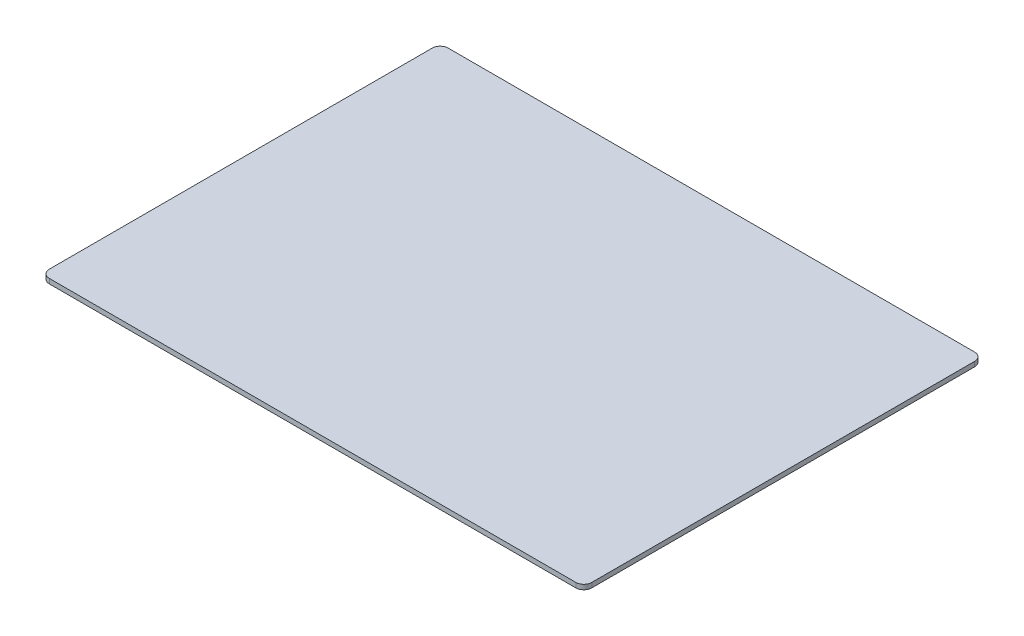
ISO-10303-21;
HEADER;
FILE_DESCRIPTION(('STEP AP214'),'2;1');
FILE_NAME('part.step','',(''),(''),'','','');
FILE_SCHEMA(('AUTOMOTIVE_DESIGN { 1 0 10303 214 1 1 1 1 }'));
ENDSEC;
DATA;
#1=APPLICATION_CONTEXT('core data for automotive mechanical design processes');
#2=APPLICATION_PROTOCOL_DEFINITION('international standard','automotive_design',2000,#1);
#3=PRODUCT_CONTEXT('',#1,'mechanical');
#4=PRODUCT('Part','Part','',(#3));
#5=PRODUCT_RELATED_PRODUCT_CATEGORY('part','',(#4));
#6=PRODUCT_DEFINITION_FORMATION('','',#4);
#7=PRODUCT_DEFINITION_CONTEXT('part definition',#1,'design');
#8=PRODUCT_DEFINITION('design','',#6,#7);
#9=PRODUCT_DEFINITION_SHAPE('','',#8);
#10=(LENGTH_UNIT() NAMED_UNIT(*) SI_UNIT(.MILLI.,.METRE.));
#11=(NAMED_UNIT(*) PLANE_ANGLE_UNIT() SI_UNIT($,.RADIAN.));
#12=(NAMED_UNIT(*) SI_UNIT($,.STERADIAN.) SOLID_ANGLE_UNIT());
#13=UNCERTAINTY_MEASURE_WITH_UNIT(LENGTH_MEASURE(1.E-05),#10,'distance_accuracy_value','');
#14=(GEOMETRIC_REPRESENTATION_CONTEXT(3) GLOBAL_UNCERTAINTY_ASSIGNED_CONTEXT((#13)) GLOBAL_UNIT_ASSIGNED_CONTEXT((#10,
#11,#12)) REPRESENTATION_CONTEXT('',''));
#15=CARTESIAN_POINT('',(0.,0.,0.));
#16=DIRECTION('',(0.,0.,1.));
#17=DIRECTION('',(1.,0.,0.));
#18=AXIS2_PLACEMENT_3D('',#15,#16,#17);
#19=CARTESIAN_POINT('',(-165.,3.,120.));
#20=DIRECTION('',(0.,-1.,0.));
#21=DIRECTION('',(0.,0.,-1.));
#22=AXIS2_PLACEMENT_3D('',#19,#20,#21);
#23=CYLINDRICAL_SURFACE('',#22,5.);
#24=CARTESIAN_POINT('',(-165.,0.,120.));
#25=DIRECTION('',(0.,1.,0.));
#26=DIRECTION('',(0.,0.,-1.));
#27=AXIS2_PLACEMENT_3D('',#24,#25,#26);
#28=CIRCLE('',#27,5.);
#29=CARTESIAN_POINT('',(-170.,0.,120.));
#30=VERTEX_POINT('',#29);
#31=CARTESIAN_POINT('',(-165.,0.,125.));
#32=VERTEX_POINT('',#31);
#33=EDGE_CURVE('E140',#30,#32,#28,.T.);
#34=ORIENTED_EDGE('',*,*,#33,.T.);
#35=DIRECTION('',(0.,-1.,0.));
#36=VECTOR('',#35,1.);
#37=CARTESIAN_POINT('',(-165.,3.,125.));
#38=LINE('',#37,#36);
#39=CARTESIAN_POINT('',(-165.,3.,125.));
#40=VERTEX_POINT('',#39);
#41=EDGE_CURVE('E11',#40,#32,#38,.T.);
#42=ORIENTED_EDGE('',*,*,#41,.F.);
#43=CARTESIAN_POINT('',(-165.,3.,120.));
#44=DIRECTION('',(0.,1.,0.));
#45=DIRECTION('',(0.,0.,-1.));
#46=AXIS2_PLACEMENT_3D('',#43,#44,#45);
#47=CIRCLE('',#46,5.);
#48=CARTESIAN_POINT('',(-170.,3.,120.));
#49=VERTEX_POINT('',#48);
#50=EDGE_CURVE('E162',#49,#40,#47,.T.);
#51=ORIENTED_EDGE('',*,*,#50,.F.);
#52=DIRECTION('',(0.,-1.,0.));
#53=VECTOR('',#52,1.);
#54=CARTESIAN_POINT('',(-170.,3.,120.));
#55=LINE('',#54,#53);
#56=EDGE_CURVE('E136',#49,#30,#55,.T.);
#57=ORIENTED_EDGE('',*,*,#56,.T.);
#58=EDGE_LOOP('',(#34,#42,#51,#57));
#59=FACE_BOUND('',#58,.T.);
#60=ADVANCED_FACE('F39',(#59),#23,.T.);
#61=CARTESIAN_POINT('',(-165.,3.,125.));
#62=DIRECTION('',(0.,0.,-1.));
#63=DIRECTION('',(-1.,0.,0.));
#64=AXIS2_PLACEMENT_3D('',#61,#62,#63);
#65=PLANE('',#64);
#66=DIRECTION('',(1.,0.,0.));
#67=VECTOR('',#66,1.);
#68=CARTESIAN_POINT('',(-165.,0.,125.));
#69=LINE('',#68,#67);
#70=CARTESIAN_POINT('',(165.,0.,125.));
#71=VERTEX_POINT('',#70);
#72=EDGE_CURVE('E144',#32,#71,#69,.T.);
#73=ORIENTED_EDGE('',*,*,#72,.T.);
#74=DIRECTION('',(0.,-1.,0.));
#75=VECTOR('',#74,1.);
#76=CARTESIAN_POINT('',(165.,3.,125.));
#77=LINE('',#76,#75);
#78=CARTESIAN_POINT('',(165.,3.,125.));
#79=VERTEX_POINT('',#78);
#80=EDGE_CURVE('E48',#79,#71,#77,.T.);
#81=ORIENTED_EDGE('',*,*,#80,.F.);
#82=DIRECTION('',(1.,0.,0.));
#83=VECTOR('',#82,1.);
#84=CARTESIAN_POINT('',(-165.,3.,125.));
#85=LINE('',#84,#83);
#86=EDGE_CURVE('E99',#40,#79,#85,.T.);
#87=ORIENTED_EDGE('',*,*,#86,.F.);
#88=ORIENTED_EDGE('',*,*,#41,.T.);
#89=EDGE_LOOP('',(#73,#81,#87,#88));
#90=FACE_BOUND('',#89,.T.);
#91=ADVANCED_FACE('F208',(#90),#65,.F.);
#92=CARTESIAN_POINT('',(165.,3.,120.));
#93=DIRECTION('',(0.,-1.,0.));
#94=DIRECTION('',(0.,0.,-1.));
#95=AXIS2_PLACEMENT_3D('',#92,#93,#94);
#96=CYLINDRICAL_SURFACE('',#95,5.);
#97=CARTESIAN_POINT('',(165.,0.,120.));
#98=DIRECTION('',(0.,1.,0.));
#99=DIRECTION('',(0.,0.,-1.));
#100=AXIS2_PLACEMENT_3D('',#97,#98,#99);
#101=CIRCLE('',#100,5.);
#102=CARTESIAN_POINT('',(170.,0.,120.));
#103=VERTEX_POINT('',#102);
#104=EDGE_CURVE('E147',#71,#103,#101,.T.);
#105=ORIENTED_EDGE('',*,*,#104,.T.);
#106=DIRECTION('',(0.,-1.,0.));
#107=VECTOR('',#106,1.);
#108=CARTESIAN_POINT('',(170.,3.,120.));
#109=LINE('',#108,#107);
#110=CARTESIAN_POINT('',(170.,3.,120.));
#111=VERTEX_POINT('',#110);
#112=EDGE_CURVE('E173',#111,#103,#109,.T.);
#113=ORIENTED_EDGE('',*,*,#112,.F.);
#114=CARTESIAN_POINT('',(165.,3.,120.));
#115=DIRECTION('',(0.,1.,0.));
#116=DIRECTION('',(0.,0.,-1.));
#117=AXIS2_PLACEMENT_3D('',#114,#115,#116);
#118=CIRCLE('',#117,5.);
#119=EDGE_CURVE('E183',#79,#111,#118,.T.);
#120=ORIENTED_EDGE('',*,*,#119,.F.);
#121=ORIENTED_EDGE('',*,*,#80,.T.);
#122=EDGE_LOOP('',(#105,#113,#120,#121));
#123=FACE_BOUND('',#122,.T.);
#124=ADVANCED_FACE('F181',(#123),#96,.T.);
#125=CARTESIAN_POINT('',(170.,3.,-120.));
#126=DIRECTION('',(-1.,0.,0.));
#127=DIRECTION('',(0.,0.,1.));
#128=AXIS2_PLACEMENT_3D('',#125,#126,#127);
#129=PLANE('',#128);
#130=DIRECTION('',(0.,0.,-1.));
#131=VECTOR('',#130,1.);
#132=CARTESIAN_POINT('',(170.,0.,-120.));
#133=LINE('',#132,#131);
#134=CARTESIAN_POINT('',(170.,0.,-120.));
#135=VERTEX_POINT('',#134);
#136=EDGE_CURVE('E150',#103,#135,#133,.T.);
#137=ORIENTED_EDGE('',*,*,#136,.T.);
#138=DIRECTION('',(0.,-1.,0.));
#139=VECTOR('',#138,1.);
#140=CARTESIAN_POINT('',(170.,3.,-120.));
#141=LINE('',#140,#139);
#142=CARTESIAN_POINT('',(170.,3.,-120.));
#143=VERTEX_POINT('',#142);
#144=EDGE_CURVE('E169',#143,#135,#141,.T.);
#145=ORIENTED_EDGE('',*,*,#144,.F.);
#146=DIRECTION('',(0.,0.,-1.));
#147=VECTOR('',#146,1.);
#148=CARTESIAN_POINT('',(170.,3.,-120.));
#149=LINE('',#148,#147);
#150=EDGE_CURVE('E196',#111,#143,#149,.T.);
#151=ORIENTED_EDGE('',*,*,#150,.F.);
#152=ORIENTED_EDGE('',*,*,#112,.T.);
#153=EDGE_LOOP('',(#137,#145,#151,#152));
#154=FACE_BOUND('',#153,.T.);
#155=ADVANCED_FACE('F191',(#154),#129,.F.);
#156=CARTESIAN_POINT('',(165.,3.,-120.));
#157=DIRECTION('',(0.,-1.,0.));
#158=DIRECTION('',(0.,0.,-1.));
#159=AXIS2_PLACEMENT_3D('',#156,#157,#158);
#160=CYLINDRICAL_SURFACE('',#159,5.);
#161=CARTESIAN_POINT('',(165.,0.,-120.));
#162=DIRECTION('',(0.,1.,0.));
#163=DIRECTION('',(0.,0.,1.));
#164=AXIS2_PLACEMENT_3D('',#161,#162,#163);
#165=CIRCLE('',#164,5.);
#166=CARTESIAN_POINT('',(165.,0.,-125.));
#167=VERTEX_POINT('',#166);
#168=EDGE_CURVE('E153',#135,#167,#165,.T.);
#169=ORIENTED_EDGE('',*,*,#168,.T.);
#170=DIRECTION('',(0.,-1.,0.));
#171=VECTOR('',#170,1.);
#172=CARTESIAN_POINT('',(165.,3.,-125.));
#173=LINE('',#172,#171);
#174=CARTESIAN_POINT('',(165.,3.,-125.));
#175=VERTEX_POINT('',#174);
#176=EDGE_CURVE('E129',#175,#167,#173,.T.);
#177=ORIENTED_EDGE('',*,*,#176,.F.);
#178=CARTESIAN_POINT('',(165.,3.,-120.));
#179=DIRECTION('',(0.,1.,0.));
#180=DIRECTION('',(0.,0.,1.));
#181=AXIS2_PLACEMENT_3D('',#178,#179,#180);
#182=CIRCLE('',#181,5.);
#183=EDGE_CURVE('E118',#143,#175,#182,.T.);
#184=ORIENTED_EDGE('',*,*,#183,.F.);
#185=ORIENTED_EDGE('',*,*,#144,.T.);
#186=EDGE_LOOP('',(#169,#177,#184,#185));
#187=FACE_BOUND('',#186,.T.);
#188=ADVANCED_FACE('F194',(#187),#160,.T.);
#189=CARTESIAN_POINT('',(-165.,3.,-125.));
#190=DIRECTION('',(0.,0.,1.));
#191=DIRECTION('',(1.,0.,0.));
#192=AXIS2_PLACEMENT_3D('',#189,#190,#191);
#193=PLANE('',#192);
#194=DIRECTION('',(-1.,0.,0.));
#195=VECTOR('',#194,1.);
#196=CARTESIAN_POINT('',(-165.,0.,-125.));
#197=LINE('',#196,#195);
#198=CARTESIAN_POINT('',(-165.,0.,-125.));
#199=VERTEX_POINT('',#198);
#200=EDGE_CURVE('E127',#167,#199,#197,.T.);
#201=ORIENTED_EDGE('',*,*,#200,.T.);
#202=DIRECTION('',(0.,-1.,0.));
#203=VECTOR('',#202,1.);
#204=CARTESIAN_POINT('',(-165.,3.,-125.));
#205=LINE('',#204,#203);
#206=CARTESIAN_POINT('',(-165.,3.,-125.));
#207=VERTEX_POINT('',#206);
#208=EDGE_CURVE('E124',#207,#199,#205,.T.);
#209=ORIENTED_EDGE('',*,*,#208,.F.);
#210=DIRECTION('',(-1.,0.,0.));
#211=VECTOR('',#210,1.);
#212=CARTESIAN_POINT('',(-165.,3.,-125.));
#213=LINE('',#212,#211);
#214=EDGE_CURVE('E112',#175,#207,#213,.T.);
#215=ORIENTED_EDGE('',*,*,#214,.F.);
#216=ORIENTED_EDGE('',*,*,#176,.T.);
#217=EDGE_LOOP('',(#201,#209,#215,#216));
#218=FACE_BOUND('',#217,.T.);
#219=ADVANCED_FACE('F125',(#218),#193,.F.);
#220=CARTESIAN_POINT('',(-165.,3.,-120.));
#221=DIRECTION('',(0.,-1.,0.));
#222=DIRECTION('',(0.,0.,-1.));
#223=AXIS2_PLACEMENT_3D('',#220,#221,#222);
#224=CYLINDRICAL_SURFACE('',#223,5.);
#225=CARTESIAN_POINT('',(-165.,0.,-120.));
#226=DIRECTION('',(0.,1.,0.));
#227=DIRECTION('',(0.,0.,1.));
#228=AXIS2_PLACEMENT_3D('',#225,#226,#227);
#229=CIRCLE('',#228,5.);
#230=CARTESIAN_POINT('',(-170.,0.,-120.));
#231=VERTEX_POINT('',#230);
#232=EDGE_CURVE('E85',#199,#231,#229,.T.);
#233=ORIENTED_EDGE('',*,*,#232,.T.);
#234=DIRECTION('',(0.,-1.,0.));
#235=VECTOR('',#234,1.);
#236=CARTESIAN_POINT('',(-170.,3.,-120.));
#237=LINE('',#236,#235);
#238=CARTESIAN_POINT('',(-170.,3.,-120.));
#239=VERTEX_POINT('',#238);
#240=EDGE_CURVE('E130',#239,#231,#237,.T.);
#241=ORIENTED_EDGE('',*,*,#240,.F.);
#242=CARTESIAN_POINT('',(-165.,3.,-120.));
#243=DIRECTION('',(0.,1.,0.));
#244=DIRECTION('',(0.,0.,1.));
#245=AXIS2_PLACEMENT_3D('',#242,#243,#244);
#246=CIRCLE('',#245,5.);
#247=EDGE_CURVE('E116',#207,#239,#246,.T.);
#248=ORIENTED_EDGE('',*,*,#247,.F.);
#249=ORIENTED_EDGE('',*,*,#208,.T.);
#250=EDGE_LOOP('',(#233,#241,#248,#249));
#251=FACE_BOUND('',#250,.T.);
#252=ADVANCED_FACE('F132',(#251),#224,.T.);
#253=CARTESIAN_POINT('',(-170.,3.,-120.));
#254=DIRECTION('',(1.,0.,0.));
#255=DIRECTION('',(0.,0.,-1.));
#256=AXIS2_PLACEMENT_3D('',#253,#254,#255);
#257=PLANE('',#256);
#258=DIRECTION('',(0.,0.,1.));
#259=VECTOR('',#258,1.);
#260=CARTESIAN_POINT('',(-170.,0.,-120.));
#261=LINE('',#260,#259);
#262=EDGE_CURVE('E91',#231,#30,#261,.T.);
#263=ORIENTED_EDGE('',*,*,#262,.T.);
#264=ORIENTED_EDGE('',*,*,#56,.F.);
#265=DIRECTION('',(0.,0.,1.));
#266=VECTOR('',#265,1.);
#267=CARTESIAN_POINT('',(-170.,3.,-120.));
#268=LINE('',#267,#266);
#269=EDGE_CURVE('E56',#239,#49,#268,.T.);
#270=ORIENTED_EDGE('',*,*,#269,.F.);
#271=ORIENTED_EDGE('',*,*,#240,.T.);
#272=EDGE_LOOP('',(#263,#264,#270,#271));
#273=FACE_BOUND('',#272,.T.);
#274=ADVANCED_FACE('F224',(#273),#257,.F.);
#275=CARTESIAN_POINT('',(-165.,3.,120.));
#276=DIRECTION('',(0.,-1.,0.));
#277=DIRECTION('',(0.,0.,-1.));
#278=AXIS2_PLACEMENT_3D('',#275,#276,#277);
#279=PLANE('',#278);
#280=ORIENTED_EDGE('',*,*,#50,.T.);
#281=ORIENTED_EDGE('',*,*,#86,.T.);
#282=ORIENTED_EDGE('',*,*,#119,.T.);
#283=ORIENTED_EDGE('',*,*,#150,.T.);
#284=ORIENTED_EDGE('',*,*,#183,.T.);
#285=ORIENTED_EDGE('',*,*,#214,.T.);
#286=ORIENTED_EDGE('',*,*,#247,.T.);
#287=ORIENTED_EDGE('',*,*,#269,.T.);
#288=EDGE_LOOP('',(#280,#281,#282,#283,#284,#285,#286,#287));
#289=FACE_BOUND('',#288,.T.);
#290=ADVANCED_FACE('F114',(#289),#279,.F.);
#291=CARTESIAN_POINT('',(-165.,0.,120.));
#292=DIRECTION('',(0.,-1.,0.));
#293=DIRECTION('',(0.,0.,-1.));
#294=AXIS2_PLACEMENT_3D('',#291,#292,#293);
#295=PLANE('',#294);
#296=ORIENTED_EDGE('',*,*,#33,.F.);
#297=ORIENTED_EDGE('',*,*,#262,.F.);
#298=ORIENTED_EDGE('',*,*,#232,.F.);
#299=ORIENTED_EDGE('',*,*,#200,.F.);
#300=ORIENTED_EDGE('',*,*,#168,.F.);
#301=ORIENTED_EDGE('',*,*,#136,.F.);
#302=ORIENTED_EDGE('',*,*,#104,.F.);
#303=ORIENTED_EDGE('',*,*,#72,.F.);
#304=EDGE_LOOP('',(#296,#297,#298,#299,#300,#301,#302,#303));
#305=FACE_BOUND('',#304,.T.);
#306=ADVANCED_FACE('F187',(#305),#295,.T.);
#307=CLOSED_SHELL('',(#60,#91,#124,#155,#188,#219,#252,#274,#290,#306));
#308=MANIFOLD_SOLID_BREP('B2',#307);
#309=ADVANCED_BREP_SHAPE_REPRESENTATION('',(#18,#308),#14);
#310=SHAPE_DEFINITION_REPRESENTATION(#9,#309);
ENDSEC;
END-ISO-10303-21;
